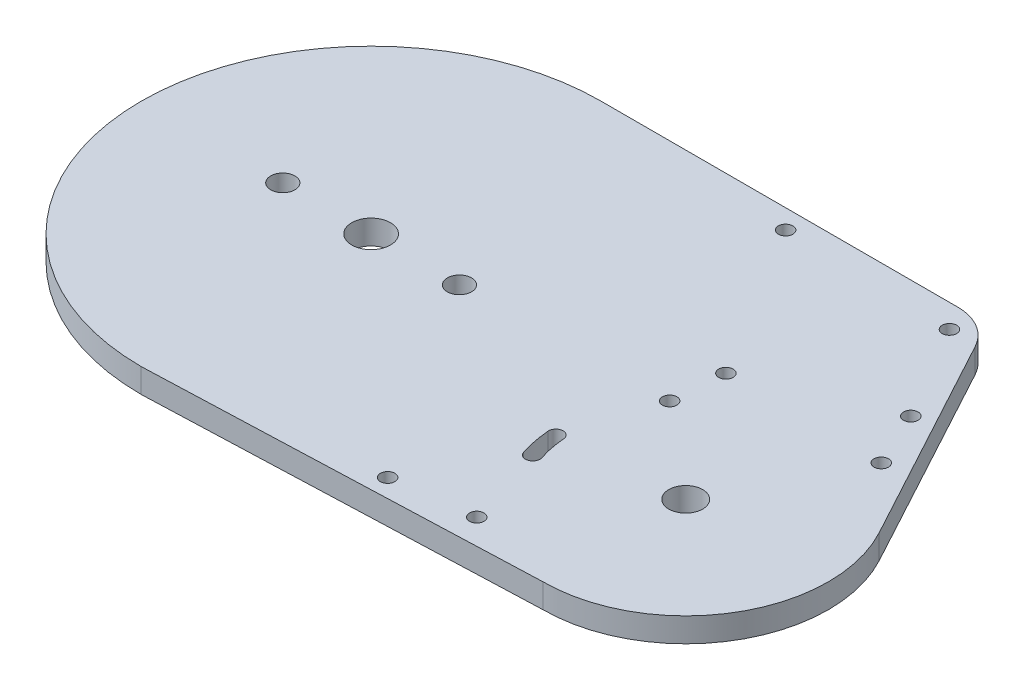
ISO-10303-21;
HEADER;
FILE_DESCRIPTION(('STEP AP214'),'2;1');
FILE_NAME('part.step','',(''),(''),'','','');
FILE_SCHEMA(('AUTOMOTIVE_DESIGN { 1 0 10303 214 1 1 1 1 }'));
ENDSEC;
DATA;
#1=APPLICATION_CONTEXT('core data for automotive mechanical design processes');
#2=APPLICATION_PROTOCOL_DEFINITION('international standard','automotive_design',2000,#1);
#3=PRODUCT_CONTEXT('',#1,'mechanical');
#4=PRODUCT('Part','Part','',(#3));
#5=PRODUCT_RELATED_PRODUCT_CATEGORY('part','',(#4));
#6=PRODUCT_DEFINITION_FORMATION('','',#4);
#7=PRODUCT_DEFINITION_CONTEXT('part definition',#1,'design');
#8=PRODUCT_DEFINITION('design','',#6,#7);
#9=PRODUCT_DEFINITION_SHAPE('','',#8);
#10=(LENGTH_UNIT() NAMED_UNIT(*) SI_UNIT(.MILLI.,.METRE.));
#11=(NAMED_UNIT(*) PLANE_ANGLE_UNIT() SI_UNIT($,.RADIAN.));
#12=(NAMED_UNIT(*) SI_UNIT($,.STERADIAN.) SOLID_ANGLE_UNIT());
#13=UNCERTAINTY_MEASURE_WITH_UNIT(LENGTH_MEASURE(1.E-05),#10,'distance_accuracy_value','');
#14=(GEOMETRIC_REPRESENTATION_CONTEXT(3) GLOBAL_UNCERTAINTY_ASSIGNED_CONTEXT((#13)) GLOBAL_UNIT_ASSIGNED_CONTEXT((#10,
#11,#12)) REPRESENTATION_CONTEXT('',''));
#15=CARTESIAN_POINT('',(0.,0.,0.));
#16=DIRECTION('',(0.,0.,1.));
#17=DIRECTION('',(1.,0.,0.));
#18=AXIS2_PLACEMENT_3D('',#15,#16,#17);
#19=CARTESIAN_POINT('',(0.,5.,0.));
#20=DIRECTION('',(0.,1.,0.));
#21=DIRECTION('',(0.,0.,1.));
#22=AXIS2_PLACEMENT_3D('',#19,#20,#21);
#23=PLANE('',#22);
#24=CARTESIAN_POINT('',(93.6880172568585,5.,-11.7110072700086));
#25=DIRECTION('',(0.,1.,0.));
#26=DIRECTION('',(0.,0.,1.));
#27=AXIS2_PLACEMENT_3D('',#24,#25,#26);
#28=CIRCLE('',#27,1.5);
#29=CARTESIAN_POINT('',(93.6880172568585,5.,-10.2110072700086));
#30=VERTEX_POINT('',#29);
#31=EDGE_CURVE('E154',#30,#30,#28,.T.);
#32=ORIENTED_EDGE('',*,*,#31,.F.);
#33=EDGE_LOOP('',(#32));
#34=FACE_BOUND('',#33,.T.);
#35=CARTESIAN_POINT('',(45.293422433837,5.,41.8850643816236));
#36=DIRECTION('',(0.,1.,0.));
#37=DIRECTION('',(0.,0.,1.));
#38=AXIS2_PLACEMENT_3D('',#35,#36,#37);
#39=CIRCLE('',#38,1.5);
#40=CARTESIAN_POINT('',(45.293422433837,5.,43.3850643816236));
#41=VERTEX_POINT('',#40);
#42=EDGE_CURVE('E166',#41,#41,#39,.T.);
#43=ORIENTED_EDGE('',*,*,#42,.F.);
#44=EDGE_LOOP('',(#43));
#45=FACE_BOUND('',#44,.T.);
#46=CARTESIAN_POINT('',(88.3546861288813,5.,-23.142870244782));
#47=DIRECTION('',(0.,1.,0.));
#48=DIRECTION('',(0.,0.,1.));
#49=AXIS2_PLACEMENT_3D('',#46,#47,#48);
#50=CIRCLE('',#49,1.50000000000003);
#51=CARTESIAN_POINT('',(88.3546861288813,5.,-21.642870244782));
#52=VERTEX_POINT('',#51);
#53=EDGE_CURVE('E178',#52,#52,#50,.T.);
#54=ORIENTED_EDGE('',*,*,#53,.F.);
#55=EDGE_LOOP('',(#54));
#56=FACE_BOUND('',#55,.T.);
#57=CARTESIAN_POINT('',(80.,5.,15.));
#58=DIRECTION('',(0.,1.,0.));
#59=DIRECTION('',(0.,0.,1.));
#60=AXIS2_PLACEMENT_3D('',#57,#58,#59);
#61=CIRCLE('',#60,3.50000000000001);
#62=CARTESIAN_POINT('',(80.,5.,18.5));
#63=VERTEX_POINT('',#62);
#64=EDGE_CURVE('E190',#63,#63,#61,.T.);
#65=ORIENTED_EDGE('',*,*,#64,.F.);
#66=EDGE_LOOP('',(#65));
#67=FACE_BOUND('',#66,.T.);
#68=CARTESIAN_POINT('',(18.25,5.,0.));
#69=DIRECTION('',(0.,1.,0.));
#70=DIRECTION('',(0.,0.,1.));
#71=AXIS2_PLACEMENT_3D('',#68,#69,#70);
#72=CIRCLE('',#71,2.5);
#73=CARTESIAN_POINT('',(18.25,5.,2.5));
#74=VERTEX_POINT('',#73);
#75=EDGE_CURVE('E202',#74,#74,#72,.T.);
#76=ORIENTED_EDGE('',*,*,#75,.F.);
#77=EDGE_LOOP('',(#76));
#78=FACE_BOUND('',#77,.T.);
#79=CARTESIAN_POINT('',(0.,5.,0.));
#80=DIRECTION('',(0.,1.,0.));
#81=DIRECTION('',(0.,0.,1.));
#82=AXIS2_PLACEMENT_3D('',#79,#80,#81);
#83=CIRCLE('',#82,4.);
#84=CARTESIAN_POINT('',(0.,5.,4.));
#85=VERTEX_POINT('',#84);
#86=EDGE_CURVE('E214',#85,#85,#83,.T.);
#87=ORIENTED_EDGE('',*,*,#86,.F.);
#88=EDGE_LOOP('',(#87));
#89=FACE_BOUND('',#88,.T.);
#90=CARTESIAN_POINT('',(0.,5.,0.));
#91=DIRECTION('',(0.,1.,0.));
#92=DIRECTION('',(0.,0.,1.));
#93=AXIS2_PLACEMENT_3D('',#90,#91,#92);
#94=CIRCLE('',#93,47.5);
#95=CARTESIAN_POINT('',(0.,5.,-47.5));
#96=VERTEX_POINT('',#95);
#97=CARTESIAN_POINT('',(0.,5.,47.5));
#98=VERTEX_POINT('',#97);
#99=EDGE_CURVE('E220',#96,#98,#94,.T.);
#100=ORIENTED_EDGE('',*,*,#99,.T.);
#101=DIRECTION('',(0.999297615709181,0.,-0.0374736605890942));
#102=VECTOR('',#101,1.);
#103=CARTESIAN_POINT('',(0.,5.,47.5));
#104=LINE('',#103,#102);
#105=CARTESIAN_POINT('',(80.,5.,44.5));
#106=VERTEX_POINT('',#105);
#107=EDGE_CURVE('E223',#98,#106,#104,.T.);
#108=ORIENTED_EDGE('',*,*,#107,.T.);
#109=CARTESIAN_POINT('',(80.,5.,15.));
#110=DIRECTION('',(0.,1.,0.));
#111=DIRECTION('',(0.,0.,1.));
#112=AXIS2_PLACEMENT_3D('',#109,#110,#111);
#113=CIRCLE('',#112,29.5);
#114=CARTESIAN_POINT('',(105.945295539341,5.,0.961067014326342));
#115=VERTEX_POINT('',#114);
#116=EDGE_CURVE('E226',#106,#115,#113,.T.);
#117=ORIENTED_EDGE('',*,*,#116,.T.);
#118=DIRECTION('',(-0.475896033412666,0.,-0.879501543706485));
#119=VECTOR('',#118,1.);
#120=CARTESIAN_POINT('',(82.5590494021999,5.,-42.2589603341267));
#121=LINE('',#120,#119);
#122=CARTESIAN_POINT('',(82.5590494021999,5.,-42.2589603341267));
#123=VERTEX_POINT('',#122);
#124=EDGE_CURVE('E228',#115,#123,#121,.T.);
#125=ORIENTED_EDGE('',*,*,#124,.T.);
#126=CARTESIAN_POINT('',(73.764033965135,5.,-37.5));
#127=DIRECTION('',(0.,1.,0.));
#128=DIRECTION('',(0.,0.,1.));
#129=AXIS2_PLACEMENT_3D('',#126,#127,#128);
#130=CIRCLE('',#129,10.);
#131=CARTESIAN_POINT('',(73.764033965135,5.,-47.5));
#132=VERTEX_POINT('',#131);
#133=EDGE_CURVE('E230',#123,#132,#130,.T.);
#134=ORIENTED_EDGE('',*,*,#133,.T.);
#135=DIRECTION('',(-1.,0.,0.));
#136=VECTOR('',#135,1.);
#137=CARTESIAN_POINT('',(0.,5.,-47.5));
#138=LINE('',#137,#136);
#139=EDGE_CURVE('E232',#132,#96,#138,.T.);
#140=ORIENTED_EDGE('',*,*,#139,.T.);
#141=EDGE_LOOP('',(#100,#108,#117,#125,#134,#140));
#142=FACE_BOUND('',#141,.T.);
#143=CARTESIAN_POINT('',(60.7426367600369,5.,-0.94220690632631));
#144=DIRECTION('',(0.,1.,0.));
#145=DIRECTION('',(0.,0.,1.));
#146=AXIS2_PLACEMENT_3D('',#143,#144,#145);
#147=CIRCLE('',#146,1.49999999999997);
#148=CARTESIAN_POINT('',(60.7426367600369,5.,0.557793093673658));
#149=VERTEX_POINT('',#148);
#150=EDGE_CURVE('E208',#149,#149,#147,.T.);
#151=ORIENTED_EDGE('',*,*,#150,.F.);
#152=EDGE_LOOP('',(#151));
#153=FACE_BOUND('',#152,.T.);
#154=CARTESIAN_POINT('',(-18.25,5.,0.));
#155=DIRECTION('',(0.,1.,0.));
#156=DIRECTION('',(0.,0.,1.));
#157=AXIS2_PLACEMENT_3D('',#154,#155,#156);
#158=CIRCLE('',#157,2.5);
#159=CARTESIAN_POINT('',(-18.25,5.,2.5));
#160=VERTEX_POINT('',#159);
#161=EDGE_CURVE('E196',#160,#160,#158,.T.);
#162=ORIENTED_EDGE('',*,*,#161,.F.);
#163=EDGE_LOOP('',(#162));
#164=FACE_BOUND('',#163,.T.);
#165=CARTESIAN_POINT('',(76.8354947574246,5.,-42.6542340460468));
#166=DIRECTION('',(0.,1.,0.));
#167=DIRECTION('',(0.,0.,1.));
#168=AXIS2_PLACEMENT_3D('',#165,#166,#167);
#169=CIRCLE('',#168,1.50000000000001);
#170=CARTESIAN_POINT('',(76.8354947574246,5.,-41.1542340460468));
#171=VERTEX_POINT('',#170);
#172=EDGE_CURVE('E184',#171,#171,#169,.T.);
#173=ORIENTED_EDGE('',*,*,#172,.F.);
#174=EDGE_LOOP('',(#173));
#175=FACE_BOUND('',#174,.T.);
#176=CARTESIAN_POINT('',(42.1373349280762,5.,-43.5));
#177=DIRECTION('',(0.,1.,0.));
#178=DIRECTION('',(0.,0.,1.));
#179=AXIS2_PLACEMENT_3D('',#176,#177,#178);
#180=CIRCLE('',#179,1.5);
#181=CARTESIAN_POINT('',(42.1373349280762,5.,-42.));
#182=VERTEX_POINT('',#181);
#183=EDGE_CURVE('E172',#182,#182,#180,.T.);
#184=ORIENTED_EDGE('',*,*,#183,.F.);
#185=EDGE_LOOP('',(#184));
#186=FACE_BOUND('',#185,.T.);
#187=CARTESIAN_POINT('',(61.5916963158707,5.,-11.7110072700086));
#188=DIRECTION('',(0.,1.,0.));
#189=DIRECTION('',(0.,0.,1.));
#190=AXIS2_PLACEMENT_3D('',#187,#188,#189);
#191=CIRCLE('',#190,1.5);
#192=CARTESIAN_POINT('',(61.5916963158707,5.,-10.2110072700086));
#193=VERTEX_POINT('',#192);
#194=EDGE_CURVE('E160',#193,#193,#191,.T.);
#195=ORIENTED_EDGE('',*,*,#194,.F.);
#196=EDGE_LOOP('',(#195));
#197=FACE_BOUND('',#196,.T.);
#198=CARTESIAN_POINT('',(61.5916963158707,5.,39.7686460153643));
#199=DIRECTION('',(0.,1.,0.));
#200=DIRECTION('',(0.,0.,1.));
#201=AXIS2_PLACEMENT_3D('',#198,#199,#200);
#202=CIRCLE('',#201,1.5);
#203=CARTESIAN_POINT('',(61.5916963158707,5.,41.2686460153643));
#204=VERTEX_POINT('',#203);
#205=EDGE_CURVE('E148',#204,#204,#202,.T.);
#206=ORIENTED_EDGE('',*,*,#205,.F.);
#207=EDGE_LOOP('',(#206));
#208=FACE_BOUND('',#207,.T.);
#209=CARTESIAN_POINT('',(80.,5.,15.));
#210=DIRECTION('',(0.,1.,0.));
#211=DIRECTION('',(0.,0.,1.));
#212=AXIS2_PLACEMENT_3D('',#209,#210,#211);
#213=CIRCLE('',#212,26.5);
#214=CARTESIAN_POINT('',(53.5774061828981,5.,17.0239901127345));
#215=VERTEX_POINT('',#214);
#216=CARTESIAN_POINT('',(54.8519176668871,5.,23.3560729393045));
#217=VERTEX_POINT('',#216);
#218=EDGE_CURVE('E120',#215,#217,#213,.T.);
#219=ORIENTED_EDGE('',*,*,#218,.F.);
#220=CARTESIAN_POINT('',(55.0730247008472,5.,16.9094246346552));
#221=DIRECTION('',(0.,1.,0.));
#222=DIRECTION('',(0.,0.,1.));
#223=AXIS2_PLACEMENT_3D('',#220,#221,#222);
#224=CIRCLE('',#223,1.5);
#225=CARTESIAN_POINT('',(56.5686432187964,5.,16.7948591565759));
#226=VERTEX_POINT('',#225);
#227=EDGE_CURVE('E112',#226,#215,#224,.T.);
#228=ORIENTED_EDGE('',*,*,#227,.F.);
#229=CARTESIAN_POINT('',(80.,5.,15.));
#230=DIRECTION('',(0.,-1.,0.));
#231=DIRECTION('',(0.,0.,1.));
#232=AXIS2_PLACEMENT_3D('',#229,#230,#231);
#233=CIRCLE('',#232,23.5);
#234=CARTESIAN_POINT('',(57.6988703838433,5.,22.4101024178739));
#235=VERTEX_POINT('',#234);
#236=EDGE_CURVE('E134',#235,#226,#233,.T.);
#237=ORIENTED_EDGE('',*,*,#236,.F.);
#238=CARTESIAN_POINT('',(56.2753940253652,5.,22.8830876785892));
#239=DIRECTION('',(0.,1.,0.));
#240=DIRECTION('',(0.,0.,1.));
#241=AXIS2_PLACEMENT_3D('',#238,#239,#240);
#242=CIRCLE('',#241,1.50000000000001);
#243=EDGE_CURVE('E132',#217,#235,#242,.T.);
#244=ORIENTED_EDGE('',*,*,#243,.F.);
#245=EDGE_LOOP('',(#219,#228,#237,#244));
#246=FACE_BOUND('',#245,.T.);
#247=ADVANCED_FACE('F35',(#34,#45,#56,#67,#78,#89,#142,#153,#164,#175,#186,#197,#208,#246),#23,.T.);
#248=CARTESIAN_POINT('',(0.,0.,0.));
#249=DIRECTION('',(0.,1.,0.));
#250=DIRECTION('',(0.,0.,1.));
#251=AXIS2_PLACEMENT_3D('',#248,#249,#250);
#252=PLANE('',#251);
#253=CARTESIAN_POINT('',(61.5916963158707,0.,39.7686460153643));
#254=DIRECTION('',(0.,1.,0.));
#255=DIRECTION('',(0.,0.,1.));
#256=AXIS2_PLACEMENT_3D('',#253,#254,#255);
#257=CIRCLE('',#256,1.5);
#258=CARTESIAN_POINT('',(61.5916963158707,0.,41.2686460153643));
#259=VERTEX_POINT('',#258);
#260=EDGE_CURVE('E128',#259,#259,#257,.T.);
#261=ORIENTED_EDGE('',*,*,#260,.T.);
#262=EDGE_LOOP('',(#261));
#263=FACE_BOUND('',#262,.T.);
#264=CARTESIAN_POINT('',(93.6880172568585,0.,-11.7110072700086));
#265=DIRECTION('',(0.,1.,0.));
#266=DIRECTION('',(0.,0.,1.));
#267=AXIS2_PLACEMENT_3D('',#264,#265,#266);
#268=CIRCLE('',#267,1.5);
#269=CARTESIAN_POINT('',(93.6880172568585,0.,-10.2110072700086));
#270=VERTEX_POINT('',#269);
#271=EDGE_CURVE('E151',#270,#270,#268,.T.);
#272=ORIENTED_EDGE('',*,*,#271,.T.);
#273=EDGE_LOOP('',(#272));
#274=FACE_BOUND('',#273,.T.);
#275=CARTESIAN_POINT('',(61.5916963158707,0.,-11.7110072700086));
#276=DIRECTION('',(0.,1.,0.));
#277=DIRECTION('',(0.,0.,1.));
#278=AXIS2_PLACEMENT_3D('',#275,#276,#277);
#279=CIRCLE('',#278,1.5);
#280=CARTESIAN_POINT('',(61.5916963158707,0.,-10.2110072700086));
#281=VERTEX_POINT('',#280);
#282=EDGE_CURVE('E157',#281,#281,#279,.T.);
#283=ORIENTED_EDGE('',*,*,#282,.T.);
#284=EDGE_LOOP('',(#283));
#285=FACE_BOUND('',#284,.T.);
#286=CARTESIAN_POINT('',(45.293422433837,0.,41.8850643816236));
#287=DIRECTION('',(0.,1.,0.));
#288=DIRECTION('',(0.,0.,1.));
#289=AXIS2_PLACEMENT_3D('',#286,#287,#288);
#290=CIRCLE('',#289,1.5);
#291=CARTESIAN_POINT('',(45.293422433837,0.,43.3850643816236));
#292=VERTEX_POINT('',#291);
#293=EDGE_CURVE('E163',#292,#292,#290,.T.);
#294=ORIENTED_EDGE('',*,*,#293,.T.);
#295=EDGE_LOOP('',(#294));
#296=FACE_BOUND('',#295,.T.);
#297=CARTESIAN_POINT('',(42.1373349280762,0.,-43.5));
#298=DIRECTION('',(0.,1.,0.));
#299=DIRECTION('',(0.,0.,1.));
#300=AXIS2_PLACEMENT_3D('',#297,#298,#299);
#301=CIRCLE('',#300,1.5);
#302=CARTESIAN_POINT('',(42.1373349280762,0.,-42.));
#303=VERTEX_POINT('',#302);
#304=EDGE_CURVE('E169',#303,#303,#301,.T.);
#305=ORIENTED_EDGE('',*,*,#304,.T.);
#306=EDGE_LOOP('',(#305));
#307=FACE_BOUND('',#306,.T.);
#308=CARTESIAN_POINT('',(88.3546861288813,0.,-23.142870244782));
#309=DIRECTION('',(0.,1.,0.));
#310=DIRECTION('',(0.,0.,1.));
#311=AXIS2_PLACEMENT_3D('',#308,#309,#310);
#312=CIRCLE('',#311,1.50000000000003);
#313=CARTESIAN_POINT('',(88.3546861288813,0.,-21.642870244782));
#314=VERTEX_POINT('',#313);
#315=EDGE_CURVE('E175',#314,#314,#312,.T.);
#316=ORIENTED_EDGE('',*,*,#315,.T.);
#317=EDGE_LOOP('',(#316));
#318=FACE_BOUND('',#317,.T.);
#319=CARTESIAN_POINT('',(76.8354947574246,0.,-42.6542340460468));
#320=DIRECTION('',(0.,1.,0.));
#321=DIRECTION('',(0.,0.,1.));
#322=AXIS2_PLACEMENT_3D('',#319,#320,#321);
#323=CIRCLE('',#322,1.50000000000001);
#324=CARTESIAN_POINT('',(76.8354947574246,0.,-41.1542340460468));
#325=VERTEX_POINT('',#324);
#326=EDGE_CURVE('E181',#325,#325,#323,.T.);
#327=ORIENTED_EDGE('',*,*,#326,.T.);
#328=EDGE_LOOP('',(#327));
#329=FACE_BOUND('',#328,.T.);
#330=CARTESIAN_POINT('',(80.,0.,15.));
#331=DIRECTION('',(0.,1.,0.));
#332=DIRECTION('',(0.,0.,1.));
#333=AXIS2_PLACEMENT_3D('',#330,#331,#332);
#334=CIRCLE('',#333,3.50000000000001);
#335=CARTESIAN_POINT('',(80.,0.,18.5));
#336=VERTEX_POINT('',#335);
#337=EDGE_CURVE('E187',#336,#336,#334,.T.);
#338=ORIENTED_EDGE('',*,*,#337,.T.);
#339=EDGE_LOOP('',(#338));
#340=FACE_BOUND('',#339,.T.);
#341=CARTESIAN_POINT('',(-18.25,0.,0.));
#342=DIRECTION('',(0.,1.,0.));
#343=DIRECTION('',(0.,0.,1.));
#344=AXIS2_PLACEMENT_3D('',#341,#342,#343);
#345=CIRCLE('',#344,2.5);
#346=CARTESIAN_POINT('',(-18.25,0.,2.5));
#347=VERTEX_POINT('',#346);
#348=EDGE_CURVE('E193',#347,#347,#345,.T.);
#349=ORIENTED_EDGE('',*,*,#348,.T.);
#350=EDGE_LOOP('',(#349));
#351=FACE_BOUND('',#350,.T.);
#352=CARTESIAN_POINT('',(18.25,0.,0.));
#353=DIRECTION('',(0.,1.,0.));
#354=DIRECTION('',(0.,0.,1.));
#355=AXIS2_PLACEMENT_3D('',#352,#353,#354);
#356=CIRCLE('',#355,2.5);
#357=CARTESIAN_POINT('',(18.25,0.,2.5));
#358=VERTEX_POINT('',#357);
#359=EDGE_CURVE('E199',#358,#358,#356,.T.);
#360=ORIENTED_EDGE('',*,*,#359,.T.);
#361=EDGE_LOOP('',(#360));
#362=FACE_BOUND('',#361,.T.);
#363=CARTESIAN_POINT('',(60.7426367600369,0.,-0.94220690632631));
#364=DIRECTION('',(0.,1.,0.));
#365=DIRECTION('',(0.,0.,1.));
#366=AXIS2_PLACEMENT_3D('',#363,#364,#365);
#367=CIRCLE('',#366,1.49999999999997);
#368=CARTESIAN_POINT('',(60.7426367600369,0.,0.557793093673658));
#369=VERTEX_POINT('',#368);
#370=EDGE_CURVE('E205',#369,#369,#367,.T.);
#371=ORIENTED_EDGE('',*,*,#370,.T.);
#372=EDGE_LOOP('',(#371));
#373=FACE_BOUND('',#372,.T.);
#374=CARTESIAN_POINT('',(0.,0.,0.));
#375=DIRECTION('',(0.,1.,0.));
#376=DIRECTION('',(0.,0.,1.));
#377=AXIS2_PLACEMENT_3D('',#374,#375,#376);
#378=CIRCLE('',#377,4.);
#379=CARTESIAN_POINT('',(0.,0.,4.));
#380=VERTEX_POINT('',#379);
#381=EDGE_CURVE('E211',#380,#380,#378,.T.);
#382=ORIENTED_EDGE('',*,*,#381,.T.);
#383=EDGE_LOOP('',(#382));
#384=FACE_BOUND('',#383,.T.);
#385=CARTESIAN_POINT('',(0.,0.,0.));
#386=DIRECTION('',(0.,1.,0.));
#387=DIRECTION('',(0.,0.,1.));
#388=AXIS2_PLACEMENT_3D('',#385,#386,#387);
#389=CIRCLE('',#388,47.5);
#390=CARTESIAN_POINT('',(0.,0.,-47.5));
#391=VERTEX_POINT('',#390);
#392=CARTESIAN_POINT('',(0.,0.,47.5));
#393=VERTEX_POINT('',#392);
#394=EDGE_CURVE('E217',#391,#393,#389,.T.);
#395=ORIENTED_EDGE('',*,*,#394,.F.);
#396=DIRECTION('',(-1.,0.,0.));
#397=VECTOR('',#396,1.);
#398=CARTESIAN_POINT('',(0.,0.,-47.5));
#399=LINE('',#398,#397);
#400=CARTESIAN_POINT('',(73.764033965135,0.,-47.5));
#401=VERTEX_POINT('',#400);
#402=EDGE_CURVE('E224',#401,#391,#399,.T.);
#403=ORIENTED_EDGE('',*,*,#402,.F.);
#404=CARTESIAN_POINT('',(73.764033965135,0.,-37.5));
#405=DIRECTION('',(0.,1.,0.));
#406=DIRECTION('',(0.,0.,1.));
#407=AXIS2_PLACEMENT_3D('',#404,#405,#406);
#408=CIRCLE('',#407,10.);
#409=CARTESIAN_POINT('',(82.5590494021999,0.,-42.2589603341267));
#410=VERTEX_POINT('',#409);
#411=EDGE_CURVE('E243',#410,#401,#408,.T.);
#412=ORIENTED_EDGE('',*,*,#411,.F.);
#413=DIRECTION('',(-0.475896033412666,0.,-0.879501543706485));
#414=VECTOR('',#413,1.);
#415=CARTESIAN_POINT('',(82.5590494021999,0.,-42.2589603341267));
#416=LINE('',#415,#414);
#417=CARTESIAN_POINT('',(105.945295539341,0.,0.961067014326342));
#418=VERTEX_POINT('',#417);
#419=EDGE_CURVE('E241',#418,#410,#416,.T.);
#420=ORIENTED_EDGE('',*,*,#419,.F.);
#421=CARTESIAN_POINT('',(80.,0.,15.));
#422=DIRECTION('',(0.,1.,0.));
#423=DIRECTION('',(0.,0.,1.));
#424=AXIS2_PLACEMENT_3D('',#421,#422,#423);
#425=CIRCLE('',#424,29.5);
#426=CARTESIAN_POINT('',(80.,0.,44.5));
#427=VERTEX_POINT('',#426);
#428=EDGE_CURVE('E239',#427,#418,#425,.T.);
#429=ORIENTED_EDGE('',*,*,#428,.F.);
#430=DIRECTION('',(0.999297615709181,0.,-0.0374736605890942));
#431=VECTOR('',#430,1.);
#432=CARTESIAN_POINT('',(0.,0.,47.5));
#433=LINE('',#432,#431);
#434=EDGE_CURVE('E237',#393,#427,#433,.T.);
#435=ORIENTED_EDGE('',*,*,#434,.F.);
#436=EDGE_LOOP('',(#395,#403,#412,#420,#429,#435));
#437=FACE_BOUND('',#436,.T.);
#438=CARTESIAN_POINT('',(55.0730247008472,0.,16.9094246346552));
#439=DIRECTION('',(0.,1.,0.));
#440=DIRECTION('',(0.,0.,1.));
#441=AXIS2_PLACEMENT_3D('',#438,#439,#440);
#442=CIRCLE('',#441,1.5);
#443=CARTESIAN_POINT('',(56.5686432187964,0.,16.7948591565759));
#444=VERTEX_POINT('',#443);
#445=CARTESIAN_POINT('',(53.5774061828981,0.,17.0239901127345));
#446=VERTEX_POINT('',#445);
#447=EDGE_CURVE('E58',#444,#446,#442,.T.);
#448=ORIENTED_EDGE('',*,*,#447,.T.);
#449=CARTESIAN_POINT('',(80.,0.,15.));
#450=DIRECTION('',(0.,1.,0.));
#451=DIRECTION('',(0.,0.,1.));
#452=AXIS2_PLACEMENT_3D('',#449,#450,#451);
#453=CIRCLE('',#452,26.5);
#454=CARTESIAN_POINT('',(54.8519176668871,0.,23.3560729393045));
#455=VERTEX_POINT('',#454);
#456=EDGE_CURVE('E127',#446,#455,#453,.T.);
#457=ORIENTED_EDGE('',*,*,#456,.T.);
#458=CARTESIAN_POINT('',(56.2753940253652,0.,22.8830876785892));
#459=DIRECTION('',(0.,1.,0.));
#460=DIRECTION('',(0.,0.,1.));
#461=AXIS2_PLACEMENT_3D('',#458,#459,#460);
#462=CIRCLE('',#461,1.50000000000001);
#463=CARTESIAN_POINT('',(57.6988703838433,0.,22.4101024178739));
#464=VERTEX_POINT('',#463);
#465=EDGE_CURVE('E140',#455,#464,#462,.T.);
#466=ORIENTED_EDGE('',*,*,#465,.T.);
#467=CARTESIAN_POINT('',(80.,0.,15.));
#468=DIRECTION('',(0.,-1.,0.));
#469=DIRECTION('',(0.,0.,1.));
#470=AXIS2_PLACEMENT_3D('',#467,#468,#469);
#471=CIRCLE('',#470,23.5);
#472=EDGE_CURVE('E121',#464,#444,#471,.T.);
#473=ORIENTED_EDGE('',*,*,#472,.T.);
#474=EDGE_LOOP('',(#448,#457,#466,#473));
#475=FACE_BOUND('',#474,.T.);
#476=ADVANCED_FACE('F267',(#263,#274,#285,#296,#307,#318,#329,#340,#351,#362,#373,#384,#437,
#475),#252,.F.);
#477=CARTESIAN_POINT('',(0.,5.,0.));
#478=DIRECTION('',(0.,-1.,0.));
#479=DIRECTION('',(0.,0.,-1.));
#480=AXIS2_PLACEMENT_3D('',#477,#478,#479);
#481=CYLINDRICAL_SURFACE('',#480,47.5);
#482=ORIENTED_EDGE('',*,*,#394,.T.);
#483=DIRECTION('',(0.,-1.,0.));
#484=VECTOR('',#483,1.);
#485=CARTESIAN_POINT('',(0.,5.,47.5));
#486=LINE('',#485,#484);
#487=EDGE_CURVE('E11',#98,#393,#486,.T.);
#488=ORIENTED_EDGE('',*,*,#487,.F.);
#489=ORIENTED_EDGE('',*,*,#99,.F.);
#490=DIRECTION('',(0.,-1.,0.));
#491=VECTOR('',#490,1.);
#492=CARTESIAN_POINT('',(0.,5.,-47.5));
#493=LINE('',#492,#491);
#494=EDGE_CURVE('E234',#96,#391,#493,.T.);
#495=ORIENTED_EDGE('',*,*,#494,.T.);
#496=EDGE_LOOP('',(#482,#488,#489,#495));
#497=FACE_BOUND('',#496,.T.);
#498=ADVANCED_FACE('F37',(#497),#481,.T.);
#499=CARTESIAN_POINT('',(0.,5.,47.5));
#500=DIRECTION('',(-0.0374736605890942,0.,-0.999297615709181));
#501=DIRECTION('',(-0.999297615709181,0.,0.0374736605890942));
#502=AXIS2_PLACEMENT_3D('',#499,#500,#501);
#503=PLANE('',#502);
#504=ORIENTED_EDGE('',*,*,#434,.T.);
#505=DIRECTION('',(0.,-1.,0.));
#506=VECTOR('',#505,1.);
#507=CARTESIAN_POINT('',(80.,5.,44.5));
#508=LINE('',#507,#506);
#509=EDGE_CURVE('E43',#106,#427,#508,.T.);
#510=ORIENTED_EDGE('',*,*,#509,.F.);
#511=ORIENTED_EDGE('',*,*,#107,.F.);
#512=ORIENTED_EDGE('',*,*,#487,.T.);
#513=EDGE_LOOP('',(#504,#510,#511,#512));
#514=FACE_BOUND('',#513,.T.);
#515=ADVANCED_FACE('F285',(#514),#503,.F.);
#516=CARTESIAN_POINT('',(80.,5.,15.));
#517=DIRECTION('',(0.,-1.,0.));
#518=DIRECTION('',(0.,0.,-1.));
#519=AXIS2_PLACEMENT_3D('',#516,#517,#518);
#520=CYLINDRICAL_SURFACE('',#519,29.5);
#521=ORIENTED_EDGE('',*,*,#428,.T.);
#522=DIRECTION('',(0.,-1.,0.));
#523=VECTOR('',#522,1.);
#524=CARTESIAN_POINT('',(105.945295539341,5.,0.961067014326342));
#525=LINE('',#524,#523);
#526=EDGE_CURVE('E254',#115,#418,#525,.T.);
#527=ORIENTED_EDGE('',*,*,#526,.F.);
#528=ORIENTED_EDGE('',*,*,#116,.F.);
#529=ORIENTED_EDGE('',*,*,#509,.T.);
#530=EDGE_LOOP('',(#521,#527,#528,#529));
#531=FACE_BOUND('',#530,.T.);
#532=ADVANCED_FACE('F261',(#531),#520,.T.);
#533=CARTESIAN_POINT('',(82.5590494021999,5.,-42.2589603341267));
#534=DIRECTION('',(-0.879501543706485,0.,0.475896033412666));
#535=DIRECTION('',(0.475896033412666,0.,0.879501543706485));
#536=AXIS2_PLACEMENT_3D('',#533,#534,#535);
#537=PLANE('',#536);
#538=ORIENTED_EDGE('',*,*,#419,.T.);
#539=DIRECTION('',(0.,-1.,0.));
#540=VECTOR('',#539,1.);
#541=CARTESIAN_POINT('',(82.5590494021999,5.,-42.2589603341267));
#542=LINE('',#541,#540);
#543=EDGE_CURVE('E251',#123,#410,#542,.T.);
#544=ORIENTED_EDGE('',*,*,#543,.F.);
#545=ORIENTED_EDGE('',*,*,#124,.F.);
#546=ORIENTED_EDGE('',*,*,#526,.T.);
#547=EDGE_LOOP('',(#538,#544,#545,#546));
#548=FACE_BOUND('',#547,.T.);
#549=ADVANCED_FACE('F273',(#548),#537,.F.);
#550=CARTESIAN_POINT('',(73.764033965135,5.,-37.5));
#551=DIRECTION('',(0.,-1.,0.));
#552=DIRECTION('',(0.,0.,-1.));
#553=AXIS2_PLACEMENT_3D('',#550,#551,#552);
#554=CYLINDRICAL_SURFACE('',#553,10.);
#555=ORIENTED_EDGE('',*,*,#411,.T.);
#556=DIRECTION('',(0.,-1.,0.));
#557=VECTOR('',#556,1.);
#558=CARTESIAN_POINT('',(73.764033965135,5.,-47.5));
#559=LINE('',#558,#557);
#560=EDGE_CURVE('E248',#132,#401,#559,.T.);
#561=ORIENTED_EDGE('',*,*,#560,.F.);
#562=ORIENTED_EDGE('',*,*,#133,.F.);
#563=ORIENTED_EDGE('',*,*,#543,.T.);
#564=EDGE_LOOP('',(#555,#561,#562,#563));
#565=FACE_BOUND('',#564,.T.);
#566=ADVANCED_FACE('F277',(#565),#554,.T.);
#567=CARTESIAN_POINT('',(0.,5.,-47.5));
#568=DIRECTION('',(0.,0.,1.));
#569=DIRECTION('',(1.,0.,0.));
#570=AXIS2_PLACEMENT_3D('',#567,#568,#569);
#571=PLANE('',#570);
#572=ORIENTED_EDGE('',*,*,#402,.T.);
#573=ORIENTED_EDGE('',*,*,#494,.F.);
#574=ORIENTED_EDGE('',*,*,#139,.F.);
#575=ORIENTED_EDGE('',*,*,#560,.T.);
#576=EDGE_LOOP('',(#572,#573,#574,#575));
#577=FACE_BOUND('',#576,.T.);
#578=ADVANCED_FACE('F288',(#577),#571,.F.);
#579=CARTESIAN_POINT('',(0.,5.,0.));
#580=DIRECTION('',(0.,-1.,0.));
#581=DIRECTION('',(0.,0.,-1.));
#582=AXIS2_PLACEMENT_3D('',#579,#580,#581);
#583=CYLINDRICAL_SURFACE('',#582,4.);
#584=ORIENTED_EDGE('',*,*,#86,.T.);
#585=EDGE_LOOP('',(#584));
#586=FACE_BOUND('',#585,.T.);
#587=ORIENTED_EDGE('',*,*,#381,.F.);
#588=EDGE_LOOP('',(#587));
#589=FACE_BOUND('',#588,.T.);
#590=ADVANCED_FACE('F290',(#586,#589),#583,.F.);
#591=CARTESIAN_POINT('',(60.7426367600369,5.,-0.94220690632631));
#592=DIRECTION('',(0.,-1.,0.));
#593=DIRECTION('',(0.,0.,-1.));
#594=AXIS2_PLACEMENT_3D('',#591,#592,#593);
#595=CYLINDRICAL_SURFACE('',#594,1.49999999999997);
#596=ORIENTED_EDGE('',*,*,#150,.T.);
#597=EDGE_LOOP('',(#596));
#598=FACE_BOUND('',#597,.T.);
#599=ORIENTED_EDGE('',*,*,#370,.F.);
#600=EDGE_LOOP('',(#599));
#601=FACE_BOUND('',#600,.T.);
#602=ADVANCED_FACE('F296',(#598,#601),#595,.F.);
#603=CARTESIAN_POINT('',(18.25,5.,0.));
#604=DIRECTION('',(0.,-1.,0.));
#605=DIRECTION('',(0.,0.,-1.));
#606=AXIS2_PLACEMENT_3D('',#603,#604,#605);
#607=CYLINDRICAL_SURFACE('',#606,2.5);
#608=ORIENTED_EDGE('',*,*,#75,.T.);
#609=EDGE_LOOP('',(#608));
#610=FACE_BOUND('',#609,.T.);
#611=ORIENTED_EDGE('',*,*,#359,.F.);
#612=EDGE_LOOP('',(#611));
#613=FACE_BOUND('',#612,.T.);
#614=ADVANCED_FACE('F313',(#610,#613),#607,.F.);
#615=CARTESIAN_POINT('',(-18.25,5.,0.));
#616=DIRECTION('',(0.,-1.,0.));
#617=DIRECTION('',(0.,0.,-1.));
#618=AXIS2_PLACEMENT_3D('',#615,#616,#617);
#619=CYLINDRICAL_SURFACE('',#618,2.5);
#620=ORIENTED_EDGE('',*,*,#161,.T.);
#621=EDGE_LOOP('',(#620));
#622=FACE_BOUND('',#621,.T.);
#623=ORIENTED_EDGE('',*,*,#348,.F.);
#624=EDGE_LOOP('',(#623));
#625=FACE_BOUND('',#624,.T.);
#626=ADVANCED_FACE('F317',(#622,#625),#619,.F.);
#627=CARTESIAN_POINT('',(80.,5.,15.));
#628=DIRECTION('',(0.,-1.,0.));
#629=DIRECTION('',(0.,0.,-1.));
#630=AXIS2_PLACEMENT_3D('',#627,#628,#629);
#631=CYLINDRICAL_SURFACE('',#630,3.50000000000001);
#632=ORIENTED_EDGE('',*,*,#64,.T.);
#633=EDGE_LOOP('',(#632));
#634=FACE_BOUND('',#633,.T.);
#635=ORIENTED_EDGE('',*,*,#337,.F.);
#636=EDGE_LOOP('',(#635));
#637=FACE_BOUND('',#636,.T.);
#638=ADVANCED_FACE('F321',(#634,#637),#631,.F.);
#639=CARTESIAN_POINT('',(76.8354947574246,5.,-42.6542340460468));
#640=DIRECTION('',(0.,-1.,0.));
#641=DIRECTION('',(0.,0.,-1.));
#642=AXIS2_PLACEMENT_3D('',#639,#640,#641);
#643=CYLINDRICAL_SURFACE('',#642,1.50000000000001);
#644=ORIENTED_EDGE('',*,*,#172,.T.);
#645=EDGE_LOOP('',(#644));
#646=FACE_BOUND('',#645,.T.);
#647=ORIENTED_EDGE('',*,*,#326,.F.);
#648=EDGE_LOOP('',(#647));
#649=FACE_BOUND('',#648,.T.);
#650=ADVANCED_FACE('F325',(#646,#649),#643,.F.);
#651=CARTESIAN_POINT('',(88.3546861288813,5.,-23.142870244782));
#652=DIRECTION('',(0.,-1.,0.));
#653=DIRECTION('',(0.,0.,-1.));
#654=AXIS2_PLACEMENT_3D('',#651,#652,#653);
#655=CYLINDRICAL_SURFACE('',#654,1.50000000000003);
#656=ORIENTED_EDGE('',*,*,#53,.T.);
#657=EDGE_LOOP('',(#656));
#658=FACE_BOUND('',#657,.T.);
#659=ORIENTED_EDGE('',*,*,#315,.F.);
#660=EDGE_LOOP('',(#659));
#661=FACE_BOUND('',#660,.T.);
#662=ADVANCED_FACE('F329',(#658,#661),#655,.F.);
#663=CARTESIAN_POINT('',(42.1373349280762,5.,-43.5));
#664=DIRECTION('',(0.,-1.,0.));
#665=DIRECTION('',(0.,0.,-1.));
#666=AXIS2_PLACEMENT_3D('',#663,#664,#665);
#667=CYLINDRICAL_SURFACE('',#666,1.5);
#668=ORIENTED_EDGE('',*,*,#183,.T.);
#669=EDGE_LOOP('',(#668));
#670=FACE_BOUND('',#669,.T.);
#671=ORIENTED_EDGE('',*,*,#304,.F.);
#672=EDGE_LOOP('',(#671));
#673=FACE_BOUND('',#672,.T.);
#674=ADVANCED_FACE('F333',(#670,#673),#667,.F.);
#675=CARTESIAN_POINT('',(45.293422433837,5.,41.8850643816236));
#676=DIRECTION('',(0.,-1.,0.));
#677=DIRECTION('',(0.,0.,-1.));
#678=AXIS2_PLACEMENT_3D('',#675,#676,#677);
#679=CYLINDRICAL_SURFACE('',#678,1.5);
#680=ORIENTED_EDGE('',*,*,#42,.T.);
#681=EDGE_LOOP('',(#680));
#682=FACE_BOUND('',#681,.T.);
#683=ORIENTED_EDGE('',*,*,#293,.F.);
#684=EDGE_LOOP('',(#683));
#685=FACE_BOUND('',#684,.T.);
#686=ADVANCED_FACE('F337',(#682,#685),#679,.F.);
#687=CARTESIAN_POINT('',(61.5916963158707,5.,-11.7110072700086));
#688=DIRECTION('',(0.,-1.,0.));
#689=DIRECTION('',(0.,0.,-1.));
#690=AXIS2_PLACEMENT_3D('',#687,#688,#689);
#691=CYLINDRICAL_SURFACE('',#690,1.5);
#692=ORIENTED_EDGE('',*,*,#194,.T.);
#693=EDGE_LOOP('',(#692));
#694=FACE_BOUND('',#693,.T.);
#695=ORIENTED_EDGE('',*,*,#282,.F.);
#696=EDGE_LOOP('',(#695));
#697=FACE_BOUND('',#696,.T.);
#698=ADVANCED_FACE('F341',(#694,#697),#691,.F.);
#699=CARTESIAN_POINT('',(93.6880172568585,5.,-11.7110072700086));
#700=DIRECTION('',(0.,-1.,0.));
#701=DIRECTION('',(0.,0.,-1.));
#702=AXIS2_PLACEMENT_3D('',#699,#700,#701);
#703=CYLINDRICAL_SURFACE('',#702,1.5);
#704=ORIENTED_EDGE('',*,*,#31,.T.);
#705=EDGE_LOOP('',(#704));
#706=FACE_BOUND('',#705,.T.);
#707=ORIENTED_EDGE('',*,*,#271,.F.);
#708=EDGE_LOOP('',(#707));
#709=FACE_BOUND('',#708,.T.);
#710=ADVANCED_FACE('F345',(#706,#709),#703,.F.);
#711=CARTESIAN_POINT('',(61.5916963158707,5.,39.7686460153643));
#712=DIRECTION('',(0.,-1.,0.));
#713=DIRECTION('',(0.,0.,-1.));
#714=AXIS2_PLACEMENT_3D('',#711,#712,#713);
#715=CYLINDRICAL_SURFACE('',#714,1.5);
#716=ORIENTED_EDGE('',*,*,#205,.T.);
#717=EDGE_LOOP('',(#716));
#718=FACE_BOUND('',#717,.T.);
#719=ORIENTED_EDGE('',*,*,#260,.F.);
#720=EDGE_LOOP('',(#719));
#721=FACE_BOUND('',#720,.T.);
#722=ADVANCED_FACE('F349',(#718,#721),#715,.F.);
#723=CARTESIAN_POINT('',(55.0730247008472,5.,16.9094246346552));
#724=DIRECTION('',(0.,-1.,0.));
#725=DIRECTION('',(0.,0.,-1.));
#726=AXIS2_PLACEMENT_3D('',#723,#724,#725);
#727=CYLINDRICAL_SURFACE('',#726,1.5);
#728=ORIENTED_EDGE('',*,*,#447,.F.);
#729=DIRECTION('',(0.,-1.,0.));
#730=VECTOR('',#729,1.);
#731=CARTESIAN_POINT('',(56.5686432187964,5.,16.7948591565759));
#732=LINE('',#731,#730);
#733=EDGE_CURVE('E116',#226,#444,#732,.T.);
#734=ORIENTED_EDGE('',*,*,#733,.F.);
#735=ORIENTED_EDGE('',*,*,#227,.T.);
#736=DIRECTION('',(0.,-1.,0.));
#737=VECTOR('',#736,1.);
#738=CARTESIAN_POINT('',(53.5774061828981,5.,17.0239901127345));
#739=LINE('',#738,#737);
#740=EDGE_CURVE('E115',#215,#446,#739,.T.);
#741=ORIENTED_EDGE('',*,*,#740,.T.);
#742=EDGE_LOOP('',(#728,#734,#735,#741));
#743=FACE_BOUND('',#742,.T.);
#744=ADVANCED_FACE('F114',(#743),#727,.F.);
#745=CARTESIAN_POINT('',(80.,5.,15.));
#746=DIRECTION('',(0.,-1.,0.));
#747=DIRECTION('',(0.,0.,-1.));
#748=AXIS2_PLACEMENT_3D('',#745,#746,#747);
#749=CYLINDRICAL_SURFACE('',#748,26.5);
#750=ORIENTED_EDGE('',*,*,#456,.F.);
#751=ORIENTED_EDGE('',*,*,#740,.F.);
#752=ORIENTED_EDGE('',*,*,#218,.T.);
#753=DIRECTION('',(0.,-1.,0.));
#754=VECTOR('',#753,1.);
#755=CARTESIAN_POINT('',(54.8519176668871,5.,23.3560729393045));
#756=LINE('',#755,#754);
#757=EDGE_CURVE('E129',#217,#455,#756,.T.);
#758=ORIENTED_EDGE('',*,*,#757,.T.);
#759=EDGE_LOOP('',(#750,#751,#752,#758));
#760=FACE_BOUND('',#759,.T.);
#761=ADVANCED_FACE('F124',(#760),#749,.F.);
#762=CARTESIAN_POINT('',(56.2753940253652,5.,22.8830876785892));
#763=DIRECTION('',(0.,-1.,0.));
#764=DIRECTION('',(0.,0.,-1.));
#765=AXIS2_PLACEMENT_3D('',#762,#763,#764);
#766=CYLINDRICAL_SURFACE('',#765,1.50000000000001);
#767=ORIENTED_EDGE('',*,*,#465,.F.);
#768=ORIENTED_EDGE('',*,*,#757,.F.);
#769=ORIENTED_EDGE('',*,*,#243,.T.);
#770=DIRECTION('',(0.,-1.,0.));
#771=VECTOR('',#770,1.);
#772=CARTESIAN_POINT('',(57.6988703838433,5.,22.4101024178739));
#773=LINE('',#772,#771);
#774=EDGE_CURVE('E50',#235,#464,#773,.T.);
#775=ORIENTED_EDGE('',*,*,#774,.T.);
#776=EDGE_LOOP('',(#767,#768,#769,#775));
#777=FACE_BOUND('',#776,.T.);
#778=ADVANCED_FACE('F358',(#777),#766,.F.);
#779=CARTESIAN_POINT('',(80.,5.,15.));
#780=DIRECTION('',(0.,-1.,0.));
#781=DIRECTION('',(0.,0.,-1.));
#782=AXIS2_PLACEMENT_3D('',#779,#780,#781);
#783=CYLINDRICAL_SURFACE('',#782,23.5);
#784=ORIENTED_EDGE('',*,*,#472,.F.);
#785=ORIENTED_EDGE('',*,*,#774,.F.);
#786=ORIENTED_EDGE('',*,*,#236,.T.);
#787=ORIENTED_EDGE('',*,*,#733,.T.);
#788=EDGE_LOOP('',(#784,#785,#786,#787));
#789=FACE_BOUND('',#788,.T.);
#790=ADVANCED_FACE('F361',(#789),#783,.T.);
#791=CLOSED_SHELL('',(#247,#476,#498,#515,#532,#549,#566,#578,#590,#602,#614,#626,#638,#650,
#662,#674,#686,#698,#710,#722,#744,#761,#778,#790));
#792=MANIFOLD_SOLID_BREP('B2',#791);
#793=ADVANCED_BREP_SHAPE_REPRESENTATION('',(#18,#792),#14);
#794=SHAPE_DEFINITION_REPRESENTATION(#9,#793);
ENDSEC;
END-ISO-10303-21;
